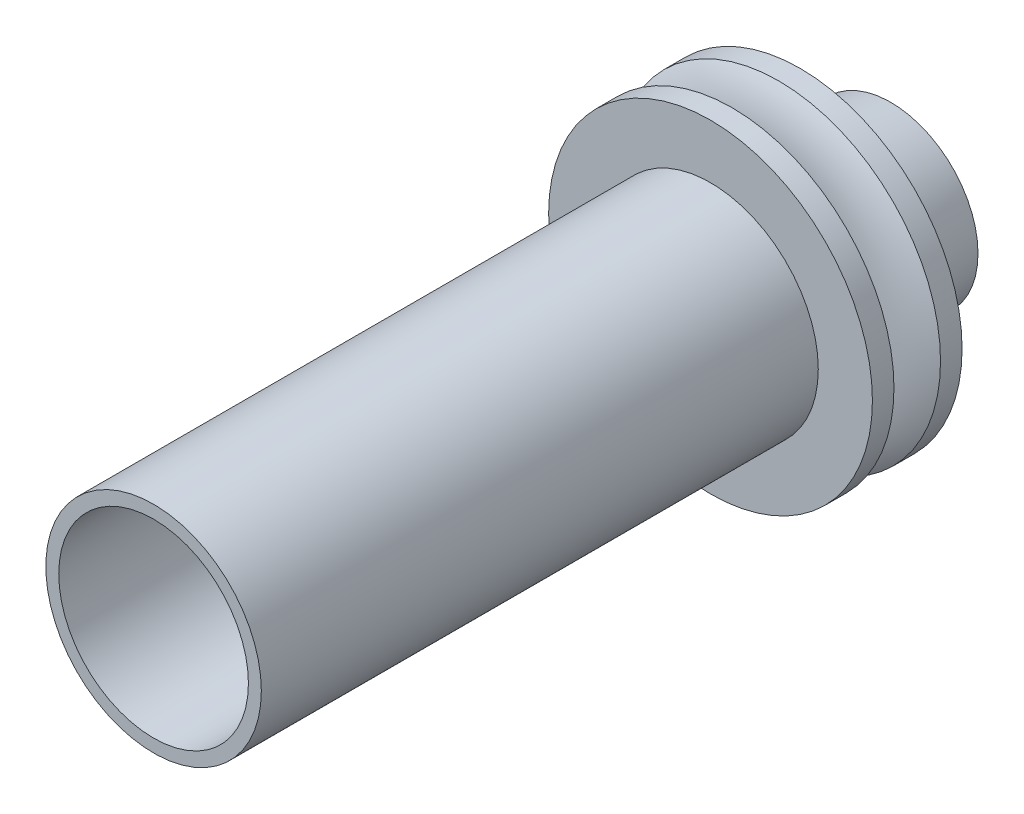
ISO-10303-21;
HEADER;
FILE_DESCRIPTION(('STEP AP214'),'2;1');
FILE_NAME('part.step','',(''),(''),'','','');
FILE_SCHEMA(('AUTOMOTIVE_DESIGN { 1 0 10303 214 1 1 1 1 }'));
ENDSEC;
DATA;
#1=APPLICATION_CONTEXT('core data for automotive mechanical design processes');
#2=APPLICATION_PROTOCOL_DEFINITION('international standard','automotive_design',2000,#1);
#3=PRODUCT_CONTEXT('',#1,'mechanical');
#4=PRODUCT('Part','Part','',(#3));
#5=PRODUCT_RELATED_PRODUCT_CATEGORY('part','',(#4));
#6=PRODUCT_DEFINITION_FORMATION('','',#4);
#7=PRODUCT_DEFINITION_CONTEXT('part definition',#1,'design');
#8=PRODUCT_DEFINITION('design','',#6,#7);
#9=PRODUCT_DEFINITION_SHAPE('','',#8);
#10=(LENGTH_UNIT() NAMED_UNIT(*) SI_UNIT(.MILLI.,.METRE.));
#11=(NAMED_UNIT(*) PLANE_ANGLE_UNIT() SI_UNIT($,.RADIAN.));
#12=(NAMED_UNIT(*) SI_UNIT($,.STERADIAN.) SOLID_ANGLE_UNIT());
#13=UNCERTAINTY_MEASURE_WITH_UNIT(LENGTH_MEASURE(1.E-05),#10,'distance_accuracy_value','');
#14=(GEOMETRIC_REPRESENTATION_CONTEXT(3) GLOBAL_UNCERTAINTY_ASSIGNED_CONTEXT((#13)) GLOBAL_UNIT_ASSIGNED_CONTEXT((#10,
#11,#12)) REPRESENTATION_CONTEXT('',''));
#15=CARTESIAN_POINT('',(0.,0.,0.));
#16=DIRECTION('',(0.,0.,1.));
#17=DIRECTION('',(1.,0.,0.));
#18=AXIS2_PLACEMENT_3D('',#15,#16,#17);
#19=CARTESIAN_POINT('',(0.,0.,144.855352602384));
#20=DIRECTION('',(0.,0.,-1.));
#21=DIRECTION('',(-1.,0.,0.));
#22=AXIS2_PLACEMENT_3D('',#19,#20,#21);
#23=PLANE('',#22);
#24=CARTESIAN_POINT('',(0.,0.,144.855352602384));
#25=DIRECTION('',(0.,0.,-1.));
#26=DIRECTION('',(-1.,0.,0.));
#27=AXIS2_PLACEMENT_3D('',#24,#25,#26);
#28=CIRCLE('',#27,22.);
#29=CARTESIAN_POINT('',(-22.,0.,144.855352602384));
#30=VERTEX_POINT('',#29);
#31=EDGE_CURVE('E50',#30,#30,#28,.F.);
#32=ORIENTED_EDGE('',*,*,#31,.F.);
#33=EDGE_LOOP('',(#32));
#34=FACE_BOUND('',#33,.T.);
#35=CARTESIAN_POINT('',(0.,0.,144.855352602384));
#36=DIRECTION('',(0.,0.,1.));
#37=DIRECTION('',(1.,0.,0.));
#38=AXIS2_PLACEMENT_3D('',#35,#36,#37);
#39=CIRCLE('',#38,25.);
#40=CARTESIAN_POINT('',(25.,0.,144.855352602384));
#41=VERTEX_POINT('',#40);
#42=EDGE_CURVE('E10',#41,#41,#39,.T.);
#43=ORIENTED_EDGE('',*,*,#42,.T.);
#44=EDGE_LOOP('',(#43));
#45=FACE_BOUND('',#44,.T.);
#46=ADVANCED_FACE('F31',(#34,#45),#23,.F.);
#47=CARTESIAN_POINT('',(0.,0.,32.9596412556054));
#48=DIRECTION('',(0.,0.,1.));
#49=DIRECTION('',(1.,0.,0.));
#50=AXIS2_PLACEMENT_3D('',#47,#48,#49);
#51=CYLINDRICAL_SURFACE('',#50,25.);
#52=CARTESIAN_POINT('',(0.,0.,15.6553526023835));
#53=DIRECTION('',(0.,0.,-1.));
#54=DIRECTION('',(-1.,0.,0.));
#55=AXIS2_PLACEMENT_3D('',#52,#53,#54);
#56=CIRCLE('',#55,25.);
#57=CARTESIAN_POINT('',(-25.,0.,15.6553526023835));
#58=VERTEX_POINT('',#57);
#59=EDGE_CURVE('E77',#58,#58,#56,.T.);
#60=ORIENTED_EDGE('',*,*,#59,.F.);
#61=EDGE_LOOP('',(#60));
#62=FACE_BOUND('',#61,.T.);
#63=ORIENTED_EDGE('',*,*,#42,.F.);
#64=EDGE_LOOP('',(#63));
#65=FACE_BOUND('',#64,.T.);
#66=ADVANCED_FACE('F102',(#62,#65),#51,.T.);
#67=CARTESIAN_POINT('',(0.,22.,-5.14464739761651));
#68=DIRECTION('',(0.,0.,1.));
#69=DIRECTION('',(1.,0.,0.));
#70=AXIS2_PLACEMENT_3D('',#67,#68,#69);
#71=PLANE('',#70);
#72=CARTESIAN_POINT('',(0.,0.,-5.14464739761651));
#73=DIRECTION('',(0.,0.,1.));
#74=DIRECTION('',(1.,0.,0.));
#75=AXIS2_PLACEMENT_3D('',#72,#73,#74);
#76=CIRCLE('',#75,22.);
#77=CARTESIAN_POINT('',(22.,0.,-5.14464739761651));
#78=VERTEX_POINT('',#77);
#79=EDGE_CURVE('E37',#78,#78,#76,.T.);
#80=ORIENTED_EDGE('',*,*,#79,.T.);
#81=EDGE_LOOP('',(#80));
#82=FACE_BOUND('',#81,.T.);
#83=CARTESIAN_POINT('',(0.,0.,-5.14464739761651));
#84=DIRECTION('',(0.,0.,-1.));
#85=DIRECTION('',(-1.,0.,0.));
#86=AXIS2_PLACEMENT_3D('',#83,#84,#85);
#87=CIRCLE('',#86,37.5578790217934);
#88=CARTESIAN_POINT('',(-37.5578790217934,0.,-5.14464739761651));
#89=VERTEX_POINT('',#88);
#90=EDGE_CURVE('E74',#89,#89,#87,.T.);
#91=ORIENTED_EDGE('',*,*,#90,.T.);
#92=EDGE_LOOP('',(#91));
#93=FACE_BOUND('',#92,.T.);
#94=ADVANCED_FACE('F107',(#82,#93),#71,.F.);
#95=CARTESIAN_POINT('',(0.,0.,32.9596412556054));
#96=DIRECTION('',(0.,0.,1.));
#97=DIRECTION('',(1.,0.,0.));
#98=AXIS2_PLACEMENT_3D('',#95,#96,#97);
#99=CYLINDRICAL_SURFACE('',#98,22.);
#100=ORIENTED_EDGE('',*,*,#79,.F.);
#101=EDGE_LOOP('',(#100));
#102=FACE_BOUND('',#101,.T.);
#103=CARTESIAN_POINT('',(0.,0.,-6.14464739761651));
#104=DIRECTION('',(0.,0.,1.));
#105=DIRECTION('',(1.,0.,0.));
#106=AXIS2_PLACEMENT_3D('',#103,#104,#105);
#107=CIRCLE('',#106,22.);
#108=CARTESIAN_POINT('',(22.,0.,-6.14464739761651));
#109=VERTEX_POINT('',#108);
#110=EDGE_CURVE('E41',#109,#109,#107,.T.);
#111=ORIENTED_EDGE('',*,*,#110,.T.);
#112=EDGE_LOOP('',(#111));
#113=FACE_BOUND('',#112,.T.);
#114=ADVANCED_FACE('F143',(#102,#113),#99,.T.);
#115=CARTESIAN_POINT('',(0.,0.,-26.1446473976165));
#116=DIRECTION('',(0.,0.,1.));
#117=DIRECTION('',(1.,0.,0.));
#118=AXIS2_PLACEMENT_3D('',#115,#116,#117);
#119=CONICAL_SURFACE('',#118,20.2502267294815,0.0872664625997166);
#120=ORIENTED_EDGE('',*,*,#110,.F.);
#121=EDGE_LOOP('',(#120));
#122=FACE_BOUND('',#121,.T.);
#123=CARTESIAN_POINT('',(0.,0.,-26.1446473976165));
#124=DIRECTION('',(0.,0.,1.));
#125=DIRECTION('',(1.,0.,0.));
#126=AXIS2_PLACEMENT_3D('',#123,#124,#125);
#127=CIRCLE('',#126,20.2502267294815);
#128=CARTESIAN_POINT('',(20.2502267294815,0.,-26.1446473976165));
#129=VERTEX_POINT('',#128);
#130=EDGE_CURVE('E45',#129,#129,#127,.T.);
#131=ORIENTED_EDGE('',*,*,#130,.T.);
#132=EDGE_LOOP('',(#131));
#133=FACE_BOUND('',#132,.T.);
#134=ADVANCED_FACE('F138',(#122,#133),#119,.T.);
#135=CARTESIAN_POINT('',(0.,20.2502267294815,-26.1446473976165));
#136=DIRECTION('',(0.,0.,1.));
#137=DIRECTION('',(1.,0.,0.));
#138=AXIS2_PLACEMENT_3D('',#135,#136,#137);
#139=PLANE('',#138);
#140=CARTESIAN_POINT('',(0.,0.,-26.1446473976165));
#141=DIRECTION('',(0.,0.,1.));
#142=DIRECTION('',(1.,0.,0.));
#143=AXIS2_PLACEMENT_3D('',#140,#141,#142);
#144=CIRCLE('',#143,17.2387672168515);
#145=CARTESIAN_POINT('',(17.2387672168515,0.,-26.1446473976165));
#146=VERTEX_POINT('',#145);
#147=EDGE_CURVE('E51',#146,#146,#144,.T.);
#148=ORIENTED_EDGE('',*,*,#147,.T.);
#149=EDGE_LOOP('',(#148));
#150=FACE_BOUND('',#149,.T.);
#151=ORIENTED_EDGE('',*,*,#130,.F.);
#152=EDGE_LOOP('',(#151));
#153=FACE_BOUND('',#152,.T.);
#154=ADVANCED_FACE('F115',(#150,#153),#139,.F.);
#155=CARTESIAN_POINT('',(0.,0.,32.9596412556054));
#156=DIRECTION('',(0.,0.,1.));
#157=DIRECTION('',(1.,0.,0.));
#158=AXIS2_PLACEMENT_3D('',#155,#156,#157);
#159=CYLINDRICAL_SURFACE('',#158,22.);
#160=ORIENTED_EDGE('',*,*,#31,.T.);
#161=EDGE_LOOP('',(#160));
#162=FACE_BOUND('',#161,.T.);
#163=CARTESIAN_POINT('',(0.,0.,-2.14464739761651));
#164=DIRECTION('',(0.,0.,1.));
#165=DIRECTION('',(1.,0.,0.));
#166=AXIS2_PLACEMENT_3D('',#163,#164,#165);
#167=CIRCLE('',#166,22.);
#168=CARTESIAN_POINT('',(22.,0.,-2.14464739761651));
#169=VERTEX_POINT('',#168);
#170=EDGE_CURVE('E58',#169,#169,#167,.T.);
#171=ORIENTED_EDGE('',*,*,#170,.F.);
#172=EDGE_LOOP('',(#171));
#173=FACE_BOUND('',#172,.T.);
#174=ADVANCED_FACE('F111',(#162,#173),#159,.F.);
#175=CARTESIAN_POINT('',(0.,22.,-2.14464739761651));
#176=DIRECTION('',(0.,0.,1.));
#177=DIRECTION('',(1.,0.,0.));
#178=AXIS2_PLACEMENT_3D('',#175,#176,#177);
#179=PLANE('',#178);
#180=ORIENTED_EDGE('',*,*,#170,.T.);
#181=EDGE_LOOP('',(#180));
#182=FACE_BOUND('',#181,.T.);
#183=CARTESIAN_POINT('',(0.,0.,-2.14464739761651));
#184=DIRECTION('',(0.,0.,1.));
#185=DIRECTION('',(1.,0.,0.));
#186=AXIS2_PLACEMENT_3D('',#183,#184,#185);
#187=CIRCLE('',#186,19.);
#188=CARTESIAN_POINT('',(19.,0.,-2.14464739761651));
#189=VERTEX_POINT('',#188);
#190=EDGE_CURVE('E61',#189,#189,#187,.T.);
#191=ORIENTED_EDGE('',*,*,#190,.F.);
#192=EDGE_LOOP('',(#191));
#193=FACE_BOUND('',#192,.T.);
#194=ADVANCED_FACE('F114',(#182,#193),#179,.T.);
#195=CARTESIAN_POINT('',(0.,0.,32.9596412556054));
#196=DIRECTION('',(0.,0.,1.));
#197=DIRECTION('',(1.,0.,0.));
#198=AXIS2_PLACEMENT_3D('',#195,#196,#197);
#199=CYLINDRICAL_SURFACE('',#198,19.);
#200=ORIENTED_EDGE('',*,*,#190,.T.);
#201=EDGE_LOOP('',(#200));
#202=FACE_BOUND('',#201,.T.);
#203=CARTESIAN_POINT('',(0.,0.,-6.01366456889097));
#204=DIRECTION('',(0.,0.,1.));
#205=DIRECTION('',(1.,0.,0.));
#206=AXIS2_PLACEMENT_3D('',#203,#204,#205);
#207=CIRCLE('',#206,19.);
#208=CARTESIAN_POINT('',(19.,0.,-6.01366456889097));
#209=VERTEX_POINT('',#208);
#210=EDGE_CURVE('E54',#209,#209,#207,.T.);
#211=ORIENTED_EDGE('',*,*,#210,.F.);
#212=EDGE_LOOP('',(#211));
#213=FACE_BOUND('',#212,.T.);
#214=ADVANCED_FACE('F121',(#202,#213),#199,.F.);
#215=CARTESIAN_POINT('',(0.,0.,-25.8831801693735));
#216=DIRECTION('',(0.,0.,1.));
#217=DIRECTION('',(1.,0.,0.));
#218=AXIS2_PLACEMENT_3D('',#215,#216,#217);
#219=CONICAL_SURFACE('',#218,17.2616426352063,0.0872664625997166);
#220=ORIENTED_EDGE('',*,*,#210,.T.);
#221=EDGE_LOOP('',(#220));
#222=FACE_BOUND('',#221,.T.);
#223=ORIENTED_EDGE('',*,*,#147,.F.);
#224=EDGE_LOOP('',(#223));
#225=FACE_BOUND('',#224,.T.);
#226=ADVANCED_FACE('F127',(#222,#225),#219,.F.);
#227=CARTESIAN_POINT('',(0.,0.,30.1557665142066));
#228=DIRECTION('',(0.,0.,-1.));
#229=DIRECTION('',(-1.,0.,0.));
#230=AXIS2_PLACEMENT_3D('',#227,#228,#229);
#231=TOROIDAL_SURFACE('',#230,26.3327962394288,22.5004139118231);
#232=CARTESIAN_POINT('',(0.,0.,10.6553526023835));
#233=DIRECTION('',(0.,0.,-1.));
#234=DIRECTION('',(-1.,0.,0.));
#235=AXIS2_PLACEMENT_3D('',#232,#233,#234);
#236=CIRCLE('',#235,37.5578790217934);
#237=CARTESIAN_POINT('',(-37.5578790217934,0.,10.6553526023835));
#238=VERTEX_POINT('',#237);
#239=EDGE_CURVE('E83',#238,#238,#236,.T.);
#240=ORIENTED_EDGE('',*,*,#239,.T.);
#241=EDGE_LOOP('',(#240));
#242=FACE_BOUND('',#241,.T.);
#243=CARTESIAN_POINT('',(0.,0.,7.65535260238349));
#244=DIRECTION('',(0.,0.,-1.));
#245=DIRECTION('',(-1.,0.,0.));
#246=AXIS2_PLACEMENT_3D('',#243,#244,#245);
#247=CIRCLE('',#246,26.3327962394288);
#248=CARTESIAN_POINT('',(-26.3327962394288,0.,7.65535260238349));
#249=VERTEX_POINT('',#248);
#250=EDGE_CURVE('E55',#249,#249,#247,.T.);
#251=ORIENTED_EDGE('',*,*,#250,.F.);
#252=EDGE_LOOP('',(#251));
#253=FACE_BOUND('',#252,.T.);
#254=ADVANCED_FACE('F87',(#242,#253),#231,.T.);
#255=CARTESIAN_POINT('',(0.,0.,-29.6946473976165));
#256=DIRECTION('',(0.,0.,-1.));
#257=DIRECTION('',(-1.,0.,0.));
#258=AXIS2_PLACEMENT_3D('',#255,#256,#257);
#259=CYLINDRICAL_SURFACE('',#258,26.3327962394288);
#260=ORIENTED_EDGE('',*,*,#250,.T.);
#261=EDGE_LOOP('',(#260));
#262=FACE_BOUND('',#261,.T.);
#263=CARTESIAN_POINT('',(0.,0.,2.85535260238349));
#264=DIRECTION('',(0.,0.,-1.));
#265=DIRECTION('',(-1.,0.,0.));
#266=AXIS2_PLACEMENT_3D('',#263,#264,#265);
#267=CIRCLE('',#266,26.3327962394288);
#268=CARTESIAN_POINT('',(-26.3327962394288,0.,2.85535260238349));
#269=VERTEX_POINT('',#268);
#270=EDGE_CURVE('E68',#269,#269,#267,.T.);
#271=ORIENTED_EDGE('',*,*,#270,.F.);
#272=EDGE_LOOP('',(#271));
#273=FACE_BOUND('',#272,.T.);
#274=ADVANCED_FACE('F166',(#262,#273),#259,.T.);
#275=CARTESIAN_POINT('',(0.,0.,-19.6450613094396));
#276=DIRECTION('',(0.,0.,-1.));
#277=DIRECTION('',(-1.,0.,0.));
#278=AXIS2_PLACEMENT_3D('',#275,#276,#277);
#279=TOROIDAL_SURFACE('',#278,26.3327962394288,22.5004139118231);
#280=ORIENTED_EDGE('',*,*,#270,.T.);
#281=EDGE_LOOP('',(#280));
#282=FACE_BOUND('',#281,.T.);
#283=CARTESIAN_POINT('',(0.,0.,-0.144647397616503));
#284=DIRECTION('',(0.,0.,-1.));
#285=DIRECTION('',(-1.,0.,0.));
#286=AXIS2_PLACEMENT_3D('',#283,#284,#285);
#287=CIRCLE('',#286,37.5578790217934);
#288=CARTESIAN_POINT('',(-37.5578790217934,0.,-0.144647397616503));
#289=VERTEX_POINT('',#288);
#290=EDGE_CURVE('E71',#289,#289,#287,.T.);
#291=ORIENTED_EDGE('',*,*,#290,.F.);
#292=EDGE_LOOP('',(#291));
#293=FACE_BOUND('',#292,.T.);
#294=ADVANCED_FACE('F160',(#282,#293),#279,.T.);
#295=CARTESIAN_POINT('',(0.,0.,-29.6946473976165));
#296=DIRECTION('',(0.,0.,-1.));
#297=DIRECTION('',(-1.,0.,0.));
#298=AXIS2_PLACEMENT_3D('',#295,#296,#297);
#299=CYLINDRICAL_SURFACE('',#298,37.5578790217934);
#300=ORIENTED_EDGE('',*,*,#290,.T.);
#301=EDGE_LOOP('',(#300));
#302=FACE_BOUND('',#301,.T.);
#303=ORIENTED_EDGE('',*,*,#90,.F.);
#304=EDGE_LOOP('',(#303));
#305=FACE_BOUND('',#304,.T.);
#306=ADVANCED_FACE('F98',(#302,#305),#299,.T.);
#307=CARTESIAN_POINT('',(0.,37.5578790217934,15.6553526023835));
#308=DIRECTION('',(0.,0.,1.));
#309=DIRECTION('',(1.,0.,0.));
#310=AXIS2_PLACEMENT_3D('',#307,#308,#309);
#311=PLANE('',#310);
#312=ORIENTED_EDGE('',*,*,#59,.T.);
#313=EDGE_LOOP('',(#312));
#314=FACE_BOUND('',#313,.T.);
#315=CARTESIAN_POINT('',(0.,0.,15.6553526023835));
#316=DIRECTION('',(0.,0.,-1.));
#317=DIRECTION('',(-1.,0.,0.));
#318=AXIS2_PLACEMENT_3D('',#315,#316,#317);
#319=CIRCLE('',#318,37.5578790217934);
#320=CARTESIAN_POINT('',(-37.5578790217934,0.,15.6553526023835));
#321=VERTEX_POINT('',#320);
#322=EDGE_CURVE('E80',#321,#321,#319,.T.);
#323=ORIENTED_EDGE('',*,*,#322,.F.);
#324=EDGE_LOOP('',(#323));
#325=FACE_BOUND('',#324,.T.);
#326=ADVANCED_FACE('F92',(#314,#325),#311,.T.);
#327=CARTESIAN_POINT('',(0.,0.,-29.6946473976165));
#328=DIRECTION('',(0.,0.,-1.));
#329=DIRECTION('',(-1.,0.,0.));
#330=AXIS2_PLACEMENT_3D('',#327,#328,#329);
#331=CYLINDRICAL_SURFACE('',#330,37.5578790217934);
#332=ORIENTED_EDGE('',*,*,#322,.T.);
#333=EDGE_LOOP('',(#332));
#334=FACE_BOUND('',#333,.T.);
#335=ORIENTED_EDGE('',*,*,#239,.F.);
#336=EDGE_LOOP('',(#335));
#337=FACE_BOUND('',#336,.T.);
#338=ADVANCED_FACE('F90',(#334,#337),#331,.T.);
#339=CLOSED_SHELL('',(#46,#66,#94,#114,#134,#154,#174,#194,#214,#226,#254,#274,#294,#306,#326,#338));
#340=MANIFOLD_SOLID_BREP('B2',#339);
#341=ADVANCED_BREP_SHAPE_REPRESENTATION('',(#18,#340),#14);
#342=SHAPE_DEFINITION_REPRESENTATION(#9,#341);
ENDSEC;
END-ISO-10303-21;
